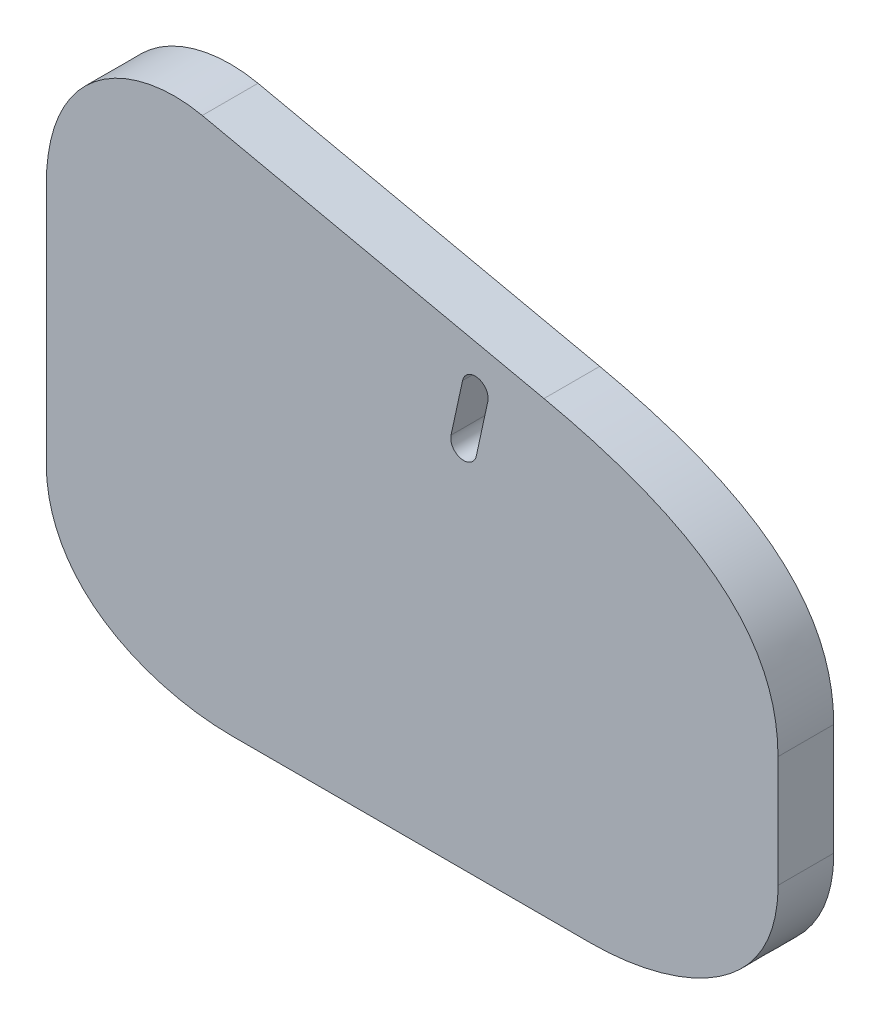
ISO-10303-21;
HEADER;
FILE_DESCRIPTION(('STEP AP214'),'2;1');
FILE_NAME('part.step','',(''),(''),'','','');
FILE_SCHEMA(('AUTOMOTIVE_DESIGN { 1 0 10303 214 1 1 1 1 }'));
ENDSEC;
DATA;
#1=APPLICATION_CONTEXT('core data for automotive mechanical design processes');
#2=APPLICATION_PROTOCOL_DEFINITION('international standard','automotive_design',2000,#1);
#3=PRODUCT_CONTEXT('',#1,'mechanical');
#4=PRODUCT('Part','Part','',(#3));
#5=PRODUCT_RELATED_PRODUCT_CATEGORY('part','',(#4));
#6=PRODUCT_DEFINITION_FORMATION('','',#4);
#7=PRODUCT_DEFINITION_CONTEXT('part definition',#1,'design');
#8=PRODUCT_DEFINITION('design','',#6,#7);
#9=PRODUCT_DEFINITION_SHAPE('','',#8);
#10=(LENGTH_UNIT() NAMED_UNIT(*) SI_UNIT(.MILLI.,.METRE.));
#11=(NAMED_UNIT(*) PLANE_ANGLE_UNIT() SI_UNIT($,.RADIAN.));
#12=(NAMED_UNIT(*) SI_UNIT($,.STERADIAN.) SOLID_ANGLE_UNIT());
#13=UNCERTAINTY_MEASURE_WITH_UNIT(LENGTH_MEASURE(1.E-05),#10,'distance_accuracy_value','');
#14=(GEOMETRIC_REPRESENTATION_CONTEXT(3) GLOBAL_UNCERTAINTY_ASSIGNED_CONTEXT((#13)) GLOBAL_UNIT_ASSIGNED_CONTEXT((#10,
#11,#12)) REPRESENTATION_CONTEXT('',''));
#15=CARTESIAN_POINT('',(0.,0.,0.));
#16=DIRECTION('',(0.,0.,1.));
#17=DIRECTION('',(1.,0.,0.));
#18=AXIS2_PLACEMENT_3D('',#15,#16,#17);
#19=CARTESIAN_POINT('',(-56.3993302443461,40.1399079020647,10.));
#20=DIRECTION('',(0.,0.,-1.));
#21=DIRECTION('',(-1.,0.,0.));
#22=AXIS2_PLACEMENT_3D('',#19,#20,#21);
#23=CYLINDRICAL_SURFACE('',#22,2.31868075153577);
#24=CARTESIAN_POINT('',(-56.3993302443461,40.1399079020647,0.));
#25=DIRECTION('',(0.,0.,1.));
#26=DIRECTION('',(1.,0.,0.));
#27=AXIS2_PLACEMENT_3D('',#24,#25,#26);
#28=CIRCLE('',#27,2.31868075153577);
#29=CARTESIAN_POINT('',(-58.6650902702296,40.6324644294307,0.));
#30=VERTEX_POINT('',#29);
#31=CARTESIAN_POINT('',(-54.1335702184626,39.6473513746988,0.));
#32=VERTEX_POINT('',#31);
#33=EDGE_CURVE('E197',#30,#32,#28,.T.);
#34=ORIENTED_EDGE('',*,*,#33,.F.);
#35=DIRECTION('',(0.,0.,-1.));
#36=VECTOR('',#35,1.);
#37=CARTESIAN_POINT('',(-58.6650902702296,40.6324644294307,10.));
#38=LINE('',#37,#36);
#39=CARTESIAN_POINT('',(-58.6650902702296,40.6324644294307,10.));
#40=VERTEX_POINT('',#39);
#41=EDGE_CURVE('E11',#40,#30,#38,.T.);
#42=ORIENTED_EDGE('',*,*,#41,.F.);
#43=CARTESIAN_POINT('',(-56.3993302443461,40.1399079020647,10.));
#44=DIRECTION('',(0.,0.,1.));
#45=DIRECTION('',(1.,0.,0.));
#46=AXIS2_PLACEMENT_3D('',#43,#44,#45);
#47=CIRCLE('',#46,2.31868075153577);
#48=CARTESIAN_POINT('',(-54.1335702184626,39.6473513746988,10.));
#49=VERTEX_POINT('',#48);
#50=EDGE_CURVE('E150',#40,#49,#47,.T.);
#51=ORIENTED_EDGE('',*,*,#50,.T.);
#52=DIRECTION('',(0.,0.,-1.));
#53=VECTOR('',#52,1.);
#54=CARTESIAN_POINT('',(-54.1335702184626,39.6473513746988,10.));
#55=LINE('',#54,#53);
#56=EDGE_CURVE('E103',#49,#32,#55,.T.);
#57=ORIENTED_EDGE('',*,*,#56,.T.);
#58=EDGE_LOOP('',(#34,#42,#51,#57));
#59=FACE_BOUND('',#58,.T.);
#60=ADVANCED_FACE('F37',(#59),#23,.F.);
#61=CARTESIAN_POINT('',(-64.4522854915812,14.0113664112133,10.));
#62=DIRECTION('',(0.977176363922801,-0.212429644331043,0.));
#63=DIRECTION('',(0.212429644331043,0.977176363922801,0.));
#64=AXIS2_PLACEMENT_3D('',#61,#62,#63);
#65=PLANE('',#64);
#66=DIRECTION('',(-0.212429644331043,-0.977176363922801,0.));
#67=VECTOR('',#66,1.);
#68=CARTESIAN_POINT('',(-64.4522854915812,14.0113664112133,0.));
#69=LINE('',#68,#67);
#70=CARTESIAN_POINT('',(-56.5985730675187,50.138443561901,0.));
#71=VERTEX_POINT('',#70);
#72=EDGE_CURVE('E142',#71,#30,#69,.T.);
#73=ORIENTED_EDGE('',*,*,#72,.F.);
#74=DIRECTION('',(0.,0.,-1.));
#75=VECTOR('',#74,1.);
#76=CARTESIAN_POINT('',(-56.5985730675187,50.138443561901,10.));
#77=LINE('',#76,#75);
#78=CARTESIAN_POINT('',(-56.5985730675187,50.138443561901,10.));
#79=VERTEX_POINT('',#78);
#80=EDGE_CURVE('E48',#79,#71,#77,.T.);
#81=ORIENTED_EDGE('',*,*,#80,.F.);
#82=DIRECTION('',(-0.212429644331043,-0.977176363922801,0.));
#83=VECTOR('',#82,1.);
#84=CARTESIAN_POINT('',(-64.4522854915812,14.0113664112133,10.));
#85=LINE('',#84,#83);
#86=EDGE_CURVE('E140',#79,#40,#85,.T.);
#87=ORIENTED_EDGE('',*,*,#86,.T.);
#88=ORIENTED_EDGE('',*,*,#41,.T.);
#89=EDGE_LOOP('',(#73,#81,#87,#88));
#90=FACE_BOUND('',#89,.T.);
#91=ADVANCED_FACE('F139',(#90),#65,.T.);
#92=CARTESIAN_POINT('',(-54.3328130416352,49.645887034535,10.));
#93=DIRECTION('',(0.,0.,-1.));
#94=DIRECTION('',(-1.,0.,0.));
#95=AXIS2_PLACEMENT_3D('',#92,#93,#94);
#96=CYLINDRICAL_SURFACE('',#95,2.31868075153577);
#97=CARTESIAN_POINT('',(-54.3328130416352,49.645887034535,0.));
#98=DIRECTION('',(0.,0.,1.));
#99=DIRECTION('',(1.,0.,0.));
#100=AXIS2_PLACEMENT_3D('',#97,#98,#99);
#101=CIRCLE('',#100,2.31868075153577);
#102=CARTESIAN_POINT('',(-52.0670530157517,49.153330507169,0.));
#103=VERTEX_POINT('',#102);
#104=EDGE_CURVE('E201',#103,#71,#101,.T.);
#105=ORIENTED_EDGE('',*,*,#104,.F.);
#106=DIRECTION('',(0.,0.,-1.));
#107=VECTOR('',#106,1.);
#108=CARTESIAN_POINT('',(-52.0670530157517,49.153330507169,10.));
#109=LINE('',#108,#107);
#110=CARTESIAN_POINT('',(-52.0670530157517,49.153330507169,10.));
#111=VERTEX_POINT('',#110);
#112=EDGE_CURVE('E96',#111,#103,#109,.T.);
#113=ORIENTED_EDGE('',*,*,#112,.F.);
#114=CARTESIAN_POINT('',(-54.3328130416352,49.645887034535,10.));
#115=DIRECTION('',(0.,0.,1.));
#116=DIRECTION('',(1.,0.,0.));
#117=AXIS2_PLACEMENT_3D('',#114,#115,#116);
#118=CIRCLE('',#117,2.31868075153577);
#119=EDGE_CURVE('E149',#111,#79,#118,.T.);
#120=ORIENTED_EDGE('',*,*,#119,.T.);
#121=ORIENTED_EDGE('',*,*,#80,.T.);
#122=EDGE_LOOP('',(#105,#113,#120,#121));
#123=FACE_BOUND('',#122,.T.);
#124=ADVANCED_FACE('F152',(#123),#96,.F.);
#125=CARTESIAN_POINT('',(-97.9695492341357,-25.7697680525164,10.));
#126=CARTESIAN_POINT('',(-112.011160689261,-25.7697680525164,10.));
#127=CARTESIAN_POINT('',(-131.292525164114,-19.0251558180361,10.));
#128=CARTESIAN_POINT('',(-131.292525164114,0.,10.));
#129=B_SPLINE_CURVE_WITH_KNOTS('',3,(#125,#126,#127,#128),.UNSPECIFIED.,.F.,.F.,(4,4),(0.,1.),.UNSPECIFIED.);
#130=DIRECTION('',(0.,0.,-1.));
#131=VECTOR('',#130,1.);
#132=SURFACE_OF_LINEAR_EXTRUSION('',#129,#131);
#133=CARTESIAN_POINT('',(-97.9695492341357,-25.7697680525164,0.));
#134=CARTESIAN_POINT('',(-112.011160689261,-25.7697680525164,0.));
#135=CARTESIAN_POINT('',(-131.292525164114,-19.0251558180361,0.));
#136=CARTESIAN_POINT('',(-131.292525164114,0.,0.));
#137=B_SPLINE_CURVE_WITH_KNOTS('',3,(#133,#134,#135,#136),.UNSPECIFIED.,.F.,.F.,(4,4),(0.,1.),.UNSPECIFIED.);
#138=CARTESIAN_POINT('',(-97.9695492341357,-25.7697680525164,0.));
#139=VERTEX_POINT('',#138);
#140=CARTESIAN_POINT('',(-131.292525164114,0.,0.));
#141=VERTEX_POINT('',#140);
#142=EDGE_CURVE('E158',#139,#141,#137,.T.);
#143=ORIENTED_EDGE('',*,*,#142,.F.);
#144=DIRECTION('',(0.,0.,-1.));
#145=VECTOR('',#144,1.);
#146=CARTESIAN_POINT('',(-97.9695492341357,-25.7697680525164,10.));
#147=LINE('',#146,#145);
#148=CARTESIAN_POINT('',(-97.9695492341357,-25.7697680525164,10.));
#149=VERTEX_POINT('',#148);
#150=EDGE_CURVE('E42',#149,#139,#147,.T.);
#151=ORIENTED_EDGE('',*,*,#150,.F.);
#152=CARTESIAN_POINT('',(-131.292525164114,0.,10.));
#153=VERTEX_POINT('',#152);
#154=EDGE_CURVE('E205',#149,#153,#129,.T.);
#155=ORIENTED_EDGE('',*,*,#154,.T.);
#156=DIRECTION('',(0.,0.,-1.));
#157=VECTOR('',#156,1.);
#158=CARTESIAN_POINT('',(-131.292525164114,0.,10.));
#159=LINE('',#158,#157);
#160=EDGE_CURVE('E154',#153,#141,#159,.T.);
#161=ORIENTED_EDGE('',*,*,#160,.T.);
#162=EDGE_LOOP('',(#143,#151,#155,#161));
#163=FACE_BOUND('',#162,.T.);
#164=ADVANCED_FACE('F39',(#163),#132,.T.);
#165=CARTESIAN_POINT('',(0.,-25.7697680525164,10.));
#166=DIRECTION('',(0.,-1.,0.));
#167=DIRECTION('',(0.,0.,-1.));
#168=AXIS2_PLACEMENT_3D('',#165,#166,#167);
#169=PLANE('',#168);
#170=DIRECTION('',(-1.,0.,0.));
#171=VECTOR('',#170,1.);
#172=CARTESIAN_POINT('',(0.,-25.7697680525164,0.));
#173=LINE('',#172,#171);
#174=CARTESIAN_POINT('',(-33.5451291028447,-25.7697680525164,0.));
#175=VERTEX_POINT('',#174);
#176=EDGE_CURVE('E163',#175,#139,#173,.T.);
#177=ORIENTED_EDGE('',*,*,#176,.F.);
#178=DIRECTION('',(0.,0.,-1.));
#179=VECTOR('',#178,1.);
#180=CARTESIAN_POINT('',(-33.5451291028447,-25.7697680525164,10.));
#181=LINE('',#180,#179);
#182=CARTESIAN_POINT('',(-33.5451291028447,-25.7697680525164,10.));
#183=VERTEX_POINT('',#182);
#184=EDGE_CURVE('E223',#183,#175,#181,.T.);
#185=ORIENTED_EDGE('',*,*,#184,.F.);
#186=DIRECTION('',(-1.,0.,0.));
#187=VECTOR('',#186,1.);
#188=CARTESIAN_POINT('',(0.,-25.7697680525164,10.));
#189=LINE('',#188,#187);
#190=EDGE_CURVE('E232',#183,#149,#189,.T.);
#191=ORIENTED_EDGE('',*,*,#190,.T.);
#192=ORIENTED_EDGE('',*,*,#150,.T.);
#193=EDGE_LOOP('',(#177,#185,#191,#192));
#194=FACE_BOUND('',#193,.T.);
#195=ADVANCED_FACE('F230',(#194),#169,.T.);
#196=CARTESIAN_POINT('',(-33.5451291028447,-25.7697680525164,10.));
#197=CARTESIAN_POINT('',(-19.4448665678301,-25.7697680525164,10.));
#198=CARTESIAN_POINT('',(0.,-19.0637574545764,10.));
#199=CARTESIAN_POINT('',(0.,0.,10.));
#200=B_SPLINE_CURVE_WITH_KNOTS('',3,(#196,#197,#198,#199),.UNSPECIFIED.,.F.,.F.,(4,4),(0.,1.),.UNSPECIFIED.);
#201=DIRECTION('',(0.,0.,-1.));
#202=VECTOR('',#201,1.);
#203=SURFACE_OF_LINEAR_EXTRUSION('',#200,#202);
#204=CARTESIAN_POINT('',(-33.5451291028447,-25.7697680525164,0.));
#205=CARTESIAN_POINT('',(-19.4448665678301,-25.7697680525164,0.));
#206=CARTESIAN_POINT('',(0.,-19.0637574545764,0.));
#207=CARTESIAN_POINT('',(0.,0.,0.));
#208=B_SPLINE_CURVE_WITH_KNOTS('',3,(#204,#205,#206,#207),.UNSPECIFIED.,.F.,.F.,(4,4),(0.,1.),.UNSPECIFIED.);
#209=CARTESIAN_POINT('',(0.,0.,0.));
#210=VERTEX_POINT('',#209);
#211=EDGE_CURVE('E169',#175,#210,#208,.T.);
#212=ORIENTED_EDGE('',*,*,#211,.T.);
#213=DIRECTION('',(0.,0.,-1.));
#214=VECTOR('',#213,1.);
#215=CARTESIAN_POINT('',(0.,0.,10.));
#216=LINE('',#215,#214);
#217=CARTESIAN_POINT('',(0.,0.,10.));
#218=VERTEX_POINT('',#217);
#219=EDGE_CURVE('E221',#218,#210,#216,.T.);
#220=ORIENTED_EDGE('',*,*,#219,.F.);
#221=EDGE_CURVE('E250',#183,#218,#200,.T.);
#222=ORIENTED_EDGE('',*,*,#221,.F.);
#223=ORIENTED_EDGE('',*,*,#184,.T.);
#224=EDGE_LOOP('',(#212,#220,#222,#223));
#225=FACE_BOUND('',#224,.T.);
#226=ADVANCED_FACE('F241',(#225),#203,.F.);
#227=CARTESIAN_POINT('',(0.,0.,10.));
#228=DIRECTION('',(-1.,0.,0.));
#229=DIRECTION('',(0.,0.,1.));
#230=AXIS2_PLACEMENT_3D('',#227,#228,#229);
#231=PLANE('',#230);
#232=DIRECTION('',(0.,1.,0.));
#233=VECTOR('',#232,1.);
#234=CARTESIAN_POINT('',(0.,0.,0.));
#235=LINE('',#234,#233);
#236=CARTESIAN_POINT('',(0.,20.,0.));
#237=VERTEX_POINT('',#236);
#238=EDGE_CURVE('E173',#210,#237,#235,.T.);
#239=ORIENTED_EDGE('',*,*,#238,.T.);
#240=DIRECTION('',(0.,0.,-1.));
#241=VECTOR('',#240,1.);
#242=CARTESIAN_POINT('',(0.,20.,10.));
#243=LINE('',#242,#241);
#244=CARTESIAN_POINT('',(0.,20.,10.));
#245=VERTEX_POINT('',#244);
#246=EDGE_CURVE('E218',#245,#237,#243,.T.);
#247=ORIENTED_EDGE('',*,*,#246,.F.);
#248=DIRECTION('',(0.,1.,0.));
#249=VECTOR('',#248,1.);
#250=CARTESIAN_POINT('',(0.,0.,10.));
#251=LINE('',#250,#249);
#252=EDGE_CURVE('E246',#218,#245,#251,.T.);
#253=ORIENTED_EDGE('',*,*,#252,.F.);
#254=ORIENTED_EDGE('',*,*,#219,.T.);
#255=EDGE_LOOP('',(#239,#247,#253,#254));
#256=FACE_BOUND('',#255,.T.);
#257=ADVANCED_FACE('F244',(#256),#231,.F.);
#258=CARTESIAN_POINT('',(0.,20.,10.));
#259=CARTESIAN_POINT('',(0.,38.1460258986672,10.));
#260=CARTESIAN_POINT('',(-14.2094741821754,48.6110988969908,10.));
#261=CARTESIAN_POINT('',(-41.9869496717725,54.6496805251641,10.));
#262=B_SPLINE_CURVE_WITH_KNOTS('',3,(#258,#259,#260,#261),.UNSPECIFIED.,.F.,.F.,(4,4),(0.,1.),.UNSPECIFIED.);
#263=DIRECTION('',(0.,0.,-1.));
#264=VECTOR('',#263,1.);
#265=SURFACE_OF_LINEAR_EXTRUSION('',#262,#264);
#266=CARTESIAN_POINT('',(0.,20.,0.));
#267=CARTESIAN_POINT('',(0.,38.1460258986672,0.));
#268=CARTESIAN_POINT('',(-14.2094741821754,48.6110988969908,0.));
#269=CARTESIAN_POINT('',(-41.9869496717725,54.6496805251641,0.));
#270=B_SPLINE_CURVE_WITH_KNOTS('',3,(#266,#267,#268,#269),.UNSPECIFIED.,.F.,.F.,(4,4),(0.,1.),.UNSPECIFIED.);
#271=CARTESIAN_POINT('',(-41.9869496717725,54.6496805251641,0.));
#272=VERTEX_POINT('',#271);
#273=EDGE_CURVE('E178',#237,#272,#270,.T.);
#274=ORIENTED_EDGE('',*,*,#273,.T.);
#275=DIRECTION('',(0.,0.,-1.));
#276=VECTOR('',#275,1.);
#277=CARTESIAN_POINT('',(-41.9869496717725,54.6496805251641,10.));
#278=LINE('',#277,#276);
#279=CARTESIAN_POINT('',(-41.9869496717725,54.6496805251641,10.));
#280=VERTEX_POINT('',#279);
#281=EDGE_CURVE('E215',#280,#272,#278,.T.);
#282=ORIENTED_EDGE('',*,*,#281,.F.);
#283=EDGE_CURVE('E249',#245,#280,#262,.T.);
#284=ORIENTED_EDGE('',*,*,#283,.F.);
#285=ORIENTED_EDGE('',*,*,#246,.T.);
#286=EDGE_LOOP('',(#274,#282,#284,#285));
#287=FACE_BOUND('',#286,.T.);
#288=ADVANCED_FACE('F268',(#287),#265,.F.);
#289=CARTESIAN_POINT('',(9.44952981696672,43.4678371580469,10.));
#290=DIRECTION('',(-0.212429644331044,-0.977176363922801,0.));
#291=DIRECTION('',(0.977176363922801,-0.212429644331044,0.));
#292=AXIS2_PLACEMENT_3D('',#289,#290,#291);
#293=PLANE('',#292);
#294=DIRECTION('',(-0.977176363922801,0.212429644331044,0.));
#295=VECTOR('',#294,1.);
#296=CARTESIAN_POINT('',(9.44952981696672,43.4678371580469,0.));
#297=LINE('',#296,#295);
#298=CARTESIAN_POINT('',(-103.301225382932,67.9788708971554,0.));
#299=VERTEX_POINT('',#298);
#300=EDGE_CURVE('E182',#272,#299,#297,.T.);
#301=ORIENTED_EDGE('',*,*,#300,.T.);
#302=DIRECTION('',(0.,0.,-1.));
#303=VECTOR('',#302,1.);
#304=CARTESIAN_POINT('',(-103.301225382932,67.9788708971554,10.));
#305=LINE('',#304,#303);
#306=CARTESIAN_POINT('',(-103.301225382932,67.9788708971554,10.));
#307=VERTEX_POINT('',#306);
#308=EDGE_CURVE('E212',#307,#299,#305,.T.);
#309=ORIENTED_EDGE('',*,*,#308,.F.);
#310=DIRECTION('',(-0.977176363922801,0.212429644331044,0.));
#311=VECTOR('',#310,1.);
#312=CARTESIAN_POINT('',(9.44952981696672,43.4678371580469,10.));
#313=LINE('',#312,#311);
#314=EDGE_CURVE('E252',#280,#307,#313,.T.);
#315=ORIENTED_EDGE('',*,*,#314,.F.);
#316=ORIENTED_EDGE('',*,*,#281,.T.);
#317=EDGE_LOOP('',(#301,#309,#315,#316));
#318=FACE_BOUND('',#317,.T.);
#319=ADVANCED_FACE('F272',(#318),#293,.F.);
#320=CARTESIAN_POINT('',(-103.301225382932,67.9788708971554,10.));
#321=CARTESIAN_POINT('',(-115.500001367253,70.6307787198339,10.));
#322=CARTESIAN_POINT('',(-131.292525164114,63.3933061839038,10.));
#323=CARTESIAN_POINT('',(-131.292525164114,43.097715536105,10.));
#324=B_SPLINE_CURVE_WITH_KNOTS('',3,(#320,#321,#322,#323),.UNSPECIFIED.,.F.,.F.,(4,4),(0.,1.),.UNSPECIFIED.);
#325=DIRECTION('',(0.,0.,-1.));
#326=VECTOR('',#325,1.);
#327=SURFACE_OF_LINEAR_EXTRUSION('',#324,#326);
#328=CARTESIAN_POINT('',(-103.301225382932,67.9788708971554,0.));
#329=CARTESIAN_POINT('',(-115.500001367253,70.6307787198339,0.));
#330=CARTESIAN_POINT('',(-131.292525164114,63.3933061839038,0.));
#331=CARTESIAN_POINT('',(-131.292525164114,43.097715536105,0.));
#332=B_SPLINE_CURVE_WITH_KNOTS('',3,(#328,#329,#330,#331),.UNSPECIFIED.,.F.,.F.,(4,4),(0.,1.),.UNSPECIFIED.);
#333=CARTESIAN_POINT('',(-131.292525164114,43.097715536105,0.));
#334=VERTEX_POINT('',#333);
#335=EDGE_CURVE('E187',#299,#334,#332,.T.);
#336=ORIENTED_EDGE('',*,*,#335,.T.);
#337=DIRECTION('',(0.,0.,-1.));
#338=VECTOR('',#337,1.);
#339=CARTESIAN_POINT('',(-131.292525164114,43.097715536105,10.));
#340=LINE('',#339,#338);
#341=CARTESIAN_POINT('',(-131.292525164114,43.097715536105,10.));
#342=VERTEX_POINT('',#341);
#343=EDGE_CURVE('E209',#342,#334,#340,.T.);
#344=ORIENTED_EDGE('',*,*,#343,.F.);
#345=EDGE_CURVE('E297',#307,#342,#324,.T.);
#346=ORIENTED_EDGE('',*,*,#345,.F.);
#347=ORIENTED_EDGE('',*,*,#308,.T.);
#348=EDGE_LOOP('',(#336,#344,#346,#347));
#349=FACE_BOUND('',#348,.T.);
#350=ADVANCED_FACE('F293',(#349),#327,.F.);
#351=CARTESIAN_POINT('',(-131.292525164114,0.,10.));
#352=DIRECTION('',(1.,0.,0.));
#353=DIRECTION('',(0.,0.,-1.));
#354=AXIS2_PLACEMENT_3D('',#351,#352,#353);
#355=PLANE('',#354);
#356=DIRECTION('',(0.,-1.,0.));
#357=VECTOR('',#356,1.);
#358=CARTESIAN_POINT('',(-131.292525164114,0.,0.));
#359=LINE('',#358,#357);
#360=EDGE_CURVE('E191',#334,#141,#359,.T.);
#361=ORIENTED_EDGE('',*,*,#360,.T.);
#362=ORIENTED_EDGE('',*,*,#160,.F.);
#363=DIRECTION('',(0.,-1.,0.));
#364=VECTOR('',#363,1.);
#365=CARTESIAN_POINT('',(-131.292525164114,0.,10.));
#366=LINE('',#365,#364);
#367=EDGE_CURVE('E302',#342,#153,#366,.T.);
#368=ORIENTED_EDGE('',*,*,#367,.F.);
#369=ORIENTED_EDGE('',*,*,#343,.T.);
#370=EDGE_LOOP('',(#361,#362,#368,#369));
#371=FACE_BOUND('',#370,.T.);
#372=ADVANCED_FACE('F290',(#371),#355,.F.);
#373=CARTESIAN_POINT('',(-59.9207654398142,13.0262533564813,10.));
#374=DIRECTION('',(0.977176363922801,-0.212429644331043,0.));
#375=DIRECTION('',(0.212429644331043,0.977176363922801,0.));
#376=AXIS2_PLACEMENT_3D('',#373,#374,#375);
#377=PLANE('',#376);
#378=DIRECTION('',(-0.212429644331043,-0.977176363922801,0.));
#379=VECTOR('',#378,1.);
#380=CARTESIAN_POINT('',(-59.9207654398142,13.0262533564813,0.));
#381=LINE('',#380,#379);
#382=EDGE_CURVE('E203',#103,#32,#381,.T.);
#383=ORIENTED_EDGE('',*,*,#382,.T.);
#384=ORIENTED_EDGE('',*,*,#56,.F.);
#385=DIRECTION('',(-0.212429644331043,-0.977176363922801,0.));
#386=VECTOR('',#385,1.);
#387=CARTESIAN_POINT('',(-59.9207654398142,13.0262533564813,10.));
#388=LINE('',#387,#386);
#389=EDGE_CURVE('E57',#111,#49,#388,.T.);
#390=ORIENTED_EDGE('',*,*,#389,.F.);
#391=ORIENTED_EDGE('',*,*,#112,.T.);
#392=EDGE_LOOP('',(#383,#384,#390,#391));
#393=FACE_BOUND('',#392,.T.);
#394=ADVANCED_FACE('F292',(#393),#377,.F.);
#395=CARTESIAN_POINT('',(0.,0.,10.));
#396=DIRECTION('',(0.,0.,1.));
#397=DIRECTION('',(1.,0.,0.));
#398=AXIS2_PLACEMENT_3D('',#395,#396,#397);
#399=PLANE('',#398);
#400=ORIENTED_EDGE('',*,*,#154,.F.);
#401=ORIENTED_EDGE('',*,*,#190,.F.);
#402=ORIENTED_EDGE('',*,*,#221,.T.);
#403=ORIENTED_EDGE('',*,*,#252,.T.);
#404=ORIENTED_EDGE('',*,*,#283,.T.);
#405=ORIENTED_EDGE('',*,*,#314,.T.);
#406=ORIENTED_EDGE('',*,*,#345,.T.);
#407=ORIENTED_EDGE('',*,*,#367,.T.);
#408=EDGE_LOOP('',(#400,#401,#402,#403,#404,#405,#406,#407));
#409=FACE_BOUND('',#408,.T.);
#410=ORIENTED_EDGE('',*,*,#50,.F.);
#411=ORIENTED_EDGE('',*,*,#86,.F.);
#412=ORIENTED_EDGE('',*,*,#119,.F.);
#413=ORIENTED_EDGE('',*,*,#389,.T.);
#414=EDGE_LOOP('',(#410,#411,#412,#413));
#415=FACE_BOUND('',#414,.T.);
#416=ADVANCED_FACE('F148',(#409,#415),#399,.T.);
#417=CARTESIAN_POINT('',(0.,0.,0.));
#418=DIRECTION('',(0.,0.,1.));
#419=DIRECTION('',(1.,0.,0.));
#420=AXIS2_PLACEMENT_3D('',#417,#418,#419);
#421=PLANE('',#420);
#422=ORIENTED_EDGE('',*,*,#142,.T.);
#423=ORIENTED_EDGE('',*,*,#360,.F.);
#424=ORIENTED_EDGE('',*,*,#335,.F.);
#425=ORIENTED_EDGE('',*,*,#300,.F.);
#426=ORIENTED_EDGE('',*,*,#273,.F.);
#427=ORIENTED_EDGE('',*,*,#238,.F.);
#428=ORIENTED_EDGE('',*,*,#211,.F.);
#429=ORIENTED_EDGE('',*,*,#176,.T.);
#430=EDGE_LOOP('',(#422,#423,#424,#425,#426,#427,#428,#429));
#431=FACE_BOUND('',#430,.T.);
#432=ORIENTED_EDGE('',*,*,#33,.T.);
#433=ORIENTED_EDGE('',*,*,#382,.F.);
#434=ORIENTED_EDGE('',*,*,#104,.T.);
#435=ORIENTED_EDGE('',*,*,#72,.T.);
#436=EDGE_LOOP('',(#432,#433,#434,#435));
#437=FACE_BOUND('',#436,.T.);
#438=ADVANCED_FACE('F236',(#431,#437),#421,.F.);
#439=CLOSED_SHELL('',(#60,#91,#124,#164,#195,#226,#257,#288,#319,#350,#372,#394,#416,#438));
#440=MANIFOLD_SOLID_BREP('B2',#439);
#441=ADVANCED_BREP_SHAPE_REPRESENTATION('',(#18,#440),#14);
#442=SHAPE_DEFINITION_REPRESENTATION(#9,#441);
ENDSEC;
END-ISO-10303-21;
